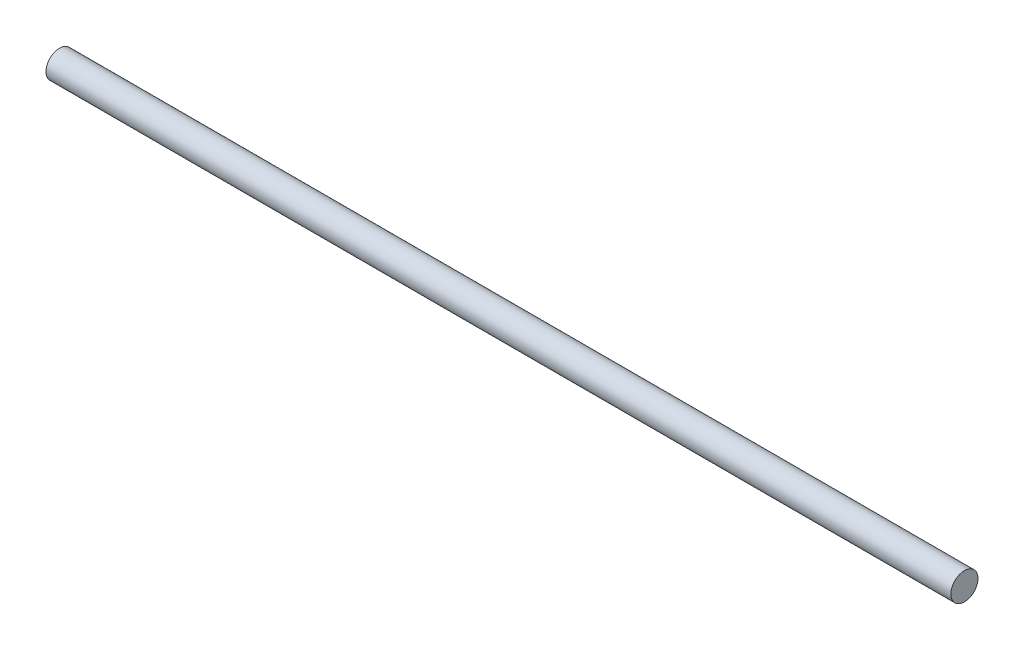
ISO-10303-21;
HEADER;
FILE_DESCRIPTION(('STEP AP214'),'2;1');
FILE_NAME('part.step','',(''),(''),'','','');
FILE_SCHEMA(('AUTOMOTIVE_DESIGN { 1 0 10303 214 1 1 1 1 }'));
ENDSEC;
DATA;
#1=APPLICATION_CONTEXT('core data for automotive mechanical design processes');
#2=APPLICATION_PROTOCOL_DEFINITION('international standard','automotive_design',2000,#1);
#3=PRODUCT_CONTEXT('',#1,'mechanical');
#4=PRODUCT('Part','Part','',(#3));
#5=PRODUCT_RELATED_PRODUCT_CATEGORY('part','',(#4));
#6=PRODUCT_DEFINITION_FORMATION('','',#4);
#7=PRODUCT_DEFINITION_CONTEXT('part definition',#1,'design');
#8=PRODUCT_DEFINITION('design','',#6,#7);
#9=PRODUCT_DEFINITION_SHAPE('','',#8);
#10=(LENGTH_UNIT() NAMED_UNIT(*) SI_UNIT(.MILLI.,.METRE.));
#11=(NAMED_UNIT(*) PLANE_ANGLE_UNIT() SI_UNIT($,.RADIAN.));
#12=(NAMED_UNIT(*) SI_UNIT($,.STERADIAN.) SOLID_ANGLE_UNIT());
#13=UNCERTAINTY_MEASURE_WITH_UNIT(LENGTH_MEASURE(1.E-05),#10,'distance_accuracy_value','');
#14=(GEOMETRIC_REPRESENTATION_CONTEXT(3) GLOBAL_UNCERTAINTY_ASSIGNED_CONTEXT((#13)) GLOBAL_UNIT_ASSIGNED_CONTEXT((#10,
#11,#12)) REPRESENTATION_CONTEXT('',''));
#15=CARTESIAN_POINT('',(0.,0.,0.));
#16=DIRECTION('',(0.,0.,1.));
#17=DIRECTION('',(1.,0.,0.));
#18=AXIS2_PLACEMENT_3D('',#15,#16,#17);
#19=CARTESIAN_POINT('',(300.,0.,0.));
#20=DIRECTION('',(-1.,0.,0.));
#21=DIRECTION('',(0.,0.,1.));
#22=AXIS2_PLACEMENT_3D('',#19,#20,#21);
#23=CYLINDRICAL_SURFACE('',#22,9.);
#24=CARTESIAN_POINT('',(300.,0.,0.));
#25=DIRECTION('',(1.,0.,0.));
#26=DIRECTION('',(0.,0.,-1.));
#27=AXIS2_PLACEMENT_3D('',#24,#25,#26);
#28=CIRCLE('',#27,9.);
#29=CARTESIAN_POINT('',(300.,0.,-9.));
#30=VERTEX_POINT('',#29);
#31=EDGE_CURVE('E10',#30,#30,#28,.T.);
#32=ORIENTED_EDGE('',*,*,#31,.F.);
#33=EDGE_LOOP('',(#32));
#34=FACE_BOUND('',#33,.T.);
#35=CARTESIAN_POINT('',(-300.,0.,0.));
#36=DIRECTION('',(1.,0.,0.));
#37=DIRECTION('',(0.,0.,-1.));
#38=AXIS2_PLACEMENT_3D('',#35,#36,#37);
#39=CIRCLE('',#38,9.);
#40=CARTESIAN_POINT('',(-300.,0.,-9.));
#41=VERTEX_POINT('',#40);
#42=EDGE_CURVE('E34',#41,#41,#39,.T.);
#43=ORIENTED_EDGE('',*,*,#42,.T.);
#44=EDGE_LOOP('',(#43));
#45=FACE_BOUND('',#44,.T.);
#46=ADVANCED_FACE('F31',(#34,#45),#23,.T.);
#47=CARTESIAN_POINT('',(300.,0.,0.));
#48=DIRECTION('',(1.,0.,0.));
#49=DIRECTION('',(0.,0.,-1.));
#50=AXIS2_PLACEMENT_3D('',#47,#48,#49);
#51=PLANE('',#50);
#52=ORIENTED_EDGE('',*,*,#31,.T.);
#53=EDGE_LOOP('',(#52));
#54=FACE_BOUND('',#53,.T.);
#55=ADVANCED_FACE('F46',(#54),#51,.T.);
#56=CARTESIAN_POINT('',(-300.,0.,0.));
#57=DIRECTION('',(1.,0.,0.));
#58=DIRECTION('',(0.,0.,-1.));
#59=AXIS2_PLACEMENT_3D('',#56,#57,#58);
#60=PLANE('',#59);
#61=ORIENTED_EDGE('',*,*,#42,.F.);
#62=EDGE_LOOP('',(#61));
#63=FACE_BOUND('',#62,.T.);
#64=ADVANCED_FACE('F44',(#63),#60,.F.);
#65=CLOSED_SHELL('',(#46,#55,#64));
#66=MANIFOLD_SOLID_BREP('B2',#65);
#67=ADVANCED_BREP_SHAPE_REPRESENTATION('',(#18,#66),#14);
#68=SHAPE_DEFINITION_REPRESENTATION(#9,#67);
ENDSEC;
END-ISO-10303-21;
